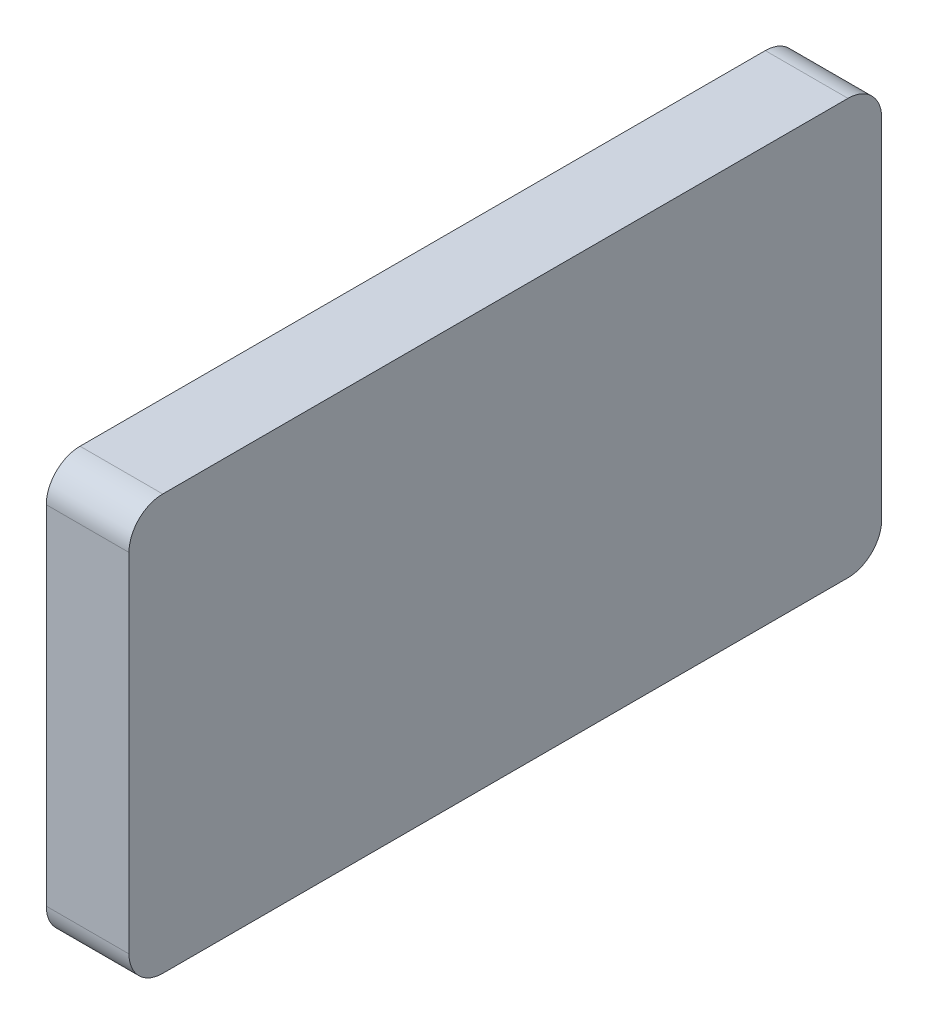
ISO-10303-21;
HEADER;
FILE_DESCRIPTION(('STEP AP214'),'2;1');
FILE_NAME('part.step','',(''),(''),'','','');
FILE_SCHEMA(('AUTOMOTIVE_DESIGN { 1 0 10303 214 1 1 1 1 }'));
ENDSEC;
DATA;
#1=APPLICATION_CONTEXT('core data for automotive mechanical design processes');
#2=APPLICATION_PROTOCOL_DEFINITION('international standard','automotive_design',2000,#1);
#3=PRODUCT_CONTEXT('',#1,'mechanical');
#4=PRODUCT('Part','Part','',(#3));
#5=PRODUCT_RELATED_PRODUCT_CATEGORY('part','',(#4));
#6=PRODUCT_DEFINITION_FORMATION('','',#4);
#7=PRODUCT_DEFINITION_CONTEXT('part definition',#1,'design');
#8=PRODUCT_DEFINITION('design','',#6,#7);
#9=PRODUCT_DEFINITION_SHAPE('','',#8);
#10=(LENGTH_UNIT() NAMED_UNIT(*) SI_UNIT(.MILLI.,.METRE.));
#11=(NAMED_UNIT(*) PLANE_ANGLE_UNIT() SI_UNIT($,.RADIAN.));
#12=(NAMED_UNIT(*) SI_UNIT($,.STERADIAN.) SOLID_ANGLE_UNIT());
#13=UNCERTAINTY_MEASURE_WITH_UNIT(LENGTH_MEASURE(1.E-05),#10,'distance_accuracy_value','');
#14=(GEOMETRIC_REPRESENTATION_CONTEXT(3) GLOBAL_UNCERTAINTY_ASSIGNED_CONTEXT((#13)) GLOBAL_UNIT_ASSIGNED_CONTEXT((#10,
#11,#12)) REPRESENTATION_CONTEXT('',''));
#15=CARTESIAN_POINT('',(0.,0.,0.));
#16=DIRECTION('',(0.,0.,1.));
#17=DIRECTION('',(1.,0.,0.));
#18=AXIS2_PLACEMENT_3D('',#15,#16,#17);
#19=CARTESIAN_POINT('',(0.45,-1.03,-2.03));
#20=DIRECTION('',(1.,0.,0.));
#21=DIRECTION('',(0.,0.,-1.));
#22=AXIS2_PLACEMENT_3D('',#19,#20,#21);
#23=PLANE('',#22);
#24=DIRECTION('',(0.,0.,-1.));
#25=VECTOR('',#24,1.);
#26=CARTESIAN_POINT('',(0.45,-1.23,2.03));
#27=LINE('',#26,#25);
#28=CARTESIAN_POINT('',(0.45,-1.23,2.03));
#29=VERTEX_POINT('',#28);
#30=CARTESIAN_POINT('',(0.45,-1.23,-2.03));
#31=VERTEX_POINT('',#30);
#32=EDGE_CURVE('E82',#29,#31,#27,.T.);
#33=ORIENTED_EDGE('',*,*,#32,.F.);
#34=CARTESIAN_POINT('',(0.45,-1.03,2.03));
#35=DIRECTION('',(-1.,0.,0.));
#36=DIRECTION('',(0.,0.,1.));
#37=AXIS2_PLACEMENT_3D('',#34,#35,#36);
#38=CIRCLE('',#37,0.2);
#39=CARTESIAN_POINT('',(0.45,-1.03,2.23));
#40=VERTEX_POINT('',#39);
#41=EDGE_CURVE('E98',#40,#29,#38,.F.);
#42=ORIENTED_EDGE('',*,*,#41,.F.);
#43=DIRECTION('',(0.,1.,0.));
#44=VECTOR('',#43,1.);
#45=CARTESIAN_POINT('',(0.45,1.03,2.23));
#46=LINE('',#45,#44);
#47=CARTESIAN_POINT('',(0.45,1.03,2.23));
#48=VERTEX_POINT('',#47);
#49=EDGE_CURVE('E104',#48,#40,#46,.F.);
#50=ORIENTED_EDGE('',*,*,#49,.F.);
#51=CARTESIAN_POINT('',(0.45,1.03,2.03));
#52=DIRECTION('',(-1.,0.,0.));
#53=DIRECTION('',(0.,0.,1.));
#54=AXIS2_PLACEMENT_3D('',#51,#52,#53);
#55=CIRCLE('',#54,0.2);
#56=CARTESIAN_POINT('',(0.45,1.23,2.03));
#57=VERTEX_POINT('',#56);
#58=EDGE_CURVE('E128',#57,#48,#55,.F.);
#59=ORIENTED_EDGE('',*,*,#58,.F.);
#60=DIRECTION('',(0.,0.,1.));
#61=VECTOR('',#60,1.);
#62=CARTESIAN_POINT('',(0.45,1.23,2.03));
#63=LINE('',#62,#61);
#64=CARTESIAN_POINT('',(0.45,1.23,-2.03));
#65=VERTEX_POINT('',#64);
#66=EDGE_CURVE('E109',#65,#57,#63,.T.);
#67=ORIENTED_EDGE('',*,*,#66,.F.);
#68=CARTESIAN_POINT('',(0.45,1.03,-2.03));
#69=DIRECTION('',(-1.,0.,0.));
#70=DIRECTION('',(0.,0.,1.));
#71=AXIS2_PLACEMENT_3D('',#68,#69,#70);
#72=CIRCLE('',#71,0.2);
#73=CARTESIAN_POINT('',(0.45,1.03,-2.23));
#74=VERTEX_POINT('',#73);
#75=EDGE_CURVE('E130',#74,#65,#72,.F.);
#76=ORIENTED_EDGE('',*,*,#75,.F.);
#77=DIRECTION('',(0.,1.,0.));
#78=VECTOR('',#77,1.);
#79=CARTESIAN_POINT('',(0.45,1.03,-2.23));
#80=LINE('',#79,#78);
#81=CARTESIAN_POINT('',(0.45,-1.03,-2.23));
#82=VERTEX_POINT('',#81);
#83=EDGE_CURVE('E84',#82,#74,#80,.T.);
#84=ORIENTED_EDGE('',*,*,#83,.F.);
#85=CARTESIAN_POINT('',(0.45,-1.03,-2.03));
#86=DIRECTION('',(-1.,0.,0.));
#87=DIRECTION('',(0.,0.,1.));
#88=AXIS2_PLACEMENT_3D('',#85,#86,#87);
#89=CIRCLE('',#88,0.2);
#90=EDGE_CURVE('E20',#31,#82,#89,.F.);
#91=ORIENTED_EDGE('',*,*,#90,.F.);
#92=EDGE_LOOP('',(#33,#42,#50,#59,#67,#76,#84,#91));
#93=FACE_BOUND('',#92,.T.);
#94=ADVANCED_FACE('F17',(#93),#23,.F.);
#95=CARTESIAN_POINT('',(0.94,-1.03,-2.03));
#96=DIRECTION('',(-1.,0.,0.));
#97=DIRECTION('',(0.,0.,1.));
#98=AXIS2_PLACEMENT_3D('',#95,#96,#97);
#99=CYLINDRICAL_SURFACE('',#98,0.2);
#100=CARTESIAN_POINT('',(0.94,-1.03,-2.03));
#101=DIRECTION('',(-1.,0.,0.));
#102=DIRECTION('',(0.,0.,1.));
#103=AXIS2_PLACEMENT_3D('',#100,#101,#102);
#104=CIRCLE('',#103,0.2);
#105=CARTESIAN_POINT('',(0.94,-1.23,-2.03));
#106=VERTEX_POINT('',#105);
#107=CARTESIAN_POINT('',(0.94,-1.03,-2.23));
#108=VERTEX_POINT('',#107);
#109=EDGE_CURVE('E91',#106,#108,#104,.F.);
#110=ORIENTED_EDGE('',*,*,#109,.F.);
#111=DIRECTION('',(1.,0.,0.));
#112=VECTOR('',#111,1.);
#113=CARTESIAN_POINT('',(0.94,-1.23,-2.03));
#114=LINE('',#113,#112);
#115=EDGE_CURVE('E88',#31,#106,#114,.T.);
#116=ORIENTED_EDGE('',*,*,#115,.F.);
#117=ORIENTED_EDGE('',*,*,#90,.T.);
#118=DIRECTION('',(-1.,0.,0.));
#119=VECTOR('',#118,1.);
#120=CARTESIAN_POINT('',(0.94,-1.03,-2.23));
#121=LINE('',#120,#119);
#122=EDGE_CURVE('E102',#108,#82,#121,.T.);
#123=ORIENTED_EDGE('',*,*,#122,.F.);
#124=EDGE_LOOP('',(#110,#116,#117,#123));
#125=FACE_BOUND('',#124,.T.);
#126=ADVANCED_FACE('F89',(#125),#99,.T.);
#127=CARTESIAN_POINT('',(0.94,1.03,-2.23));
#128=DIRECTION('',(0.,0.,-1.));
#129=DIRECTION('',(-1.,0.,0.));
#130=AXIS2_PLACEMENT_3D('',#127,#128,#129);
#131=PLANE('',#130);
#132=DIRECTION('',(0.,1.,0.));
#133=VECTOR('',#132,1.);
#134=CARTESIAN_POINT('',(0.94,-1.03,-2.23));
#135=LINE('',#134,#133);
#136=CARTESIAN_POINT('',(0.94,1.03,-2.23));
#137=VERTEX_POINT('',#136);
#138=EDGE_CURVE('E125',#108,#137,#135,.T.);
#139=ORIENTED_EDGE('',*,*,#138,.F.);
#140=ORIENTED_EDGE('',*,*,#122,.T.);
#141=ORIENTED_EDGE('',*,*,#83,.T.);
#142=DIRECTION('',(-1.,0.,0.));
#143=VECTOR('',#142,1.);
#144=CARTESIAN_POINT('',(0.94,1.03,-2.23));
#145=LINE('',#144,#143);
#146=EDGE_CURVE('E113',#137,#74,#145,.T.);
#147=ORIENTED_EDGE('',*,*,#146,.F.);
#148=EDGE_LOOP('',(#139,#140,#141,#147));
#149=FACE_BOUND('',#148,.T.);
#150=ADVANCED_FACE('F137',(#149),#131,.T.);
#151=CARTESIAN_POINT('',(0.94,1.03,-2.03));
#152=DIRECTION('',(-1.,0.,0.));
#153=DIRECTION('',(0.,0.,1.));
#154=AXIS2_PLACEMENT_3D('',#151,#152,#153);
#155=CYLINDRICAL_SURFACE('',#154,0.2);
#156=CARTESIAN_POINT('',(0.94,1.03,-2.03));
#157=DIRECTION('',(-1.,0.,0.));
#158=DIRECTION('',(0.,0.,1.));
#159=AXIS2_PLACEMENT_3D('',#156,#157,#158);
#160=CIRCLE('',#159,0.2);
#161=CARTESIAN_POINT('',(0.94,1.23,-2.03));
#162=VERTEX_POINT('',#161);
#163=EDGE_CURVE('E122',#137,#162,#160,.F.);
#164=ORIENTED_EDGE('',*,*,#163,.F.);
#165=ORIENTED_EDGE('',*,*,#146,.T.);
#166=ORIENTED_EDGE('',*,*,#75,.T.);
#167=DIRECTION('',(1.,0.,0.));
#168=VECTOR('',#167,1.);
#169=CARTESIAN_POINT('',(0.94,1.23,-2.03));
#170=LINE('',#169,#168);
#171=EDGE_CURVE('E112',#162,#65,#170,.F.);
#172=ORIENTED_EDGE('',*,*,#171,.F.);
#173=EDGE_LOOP('',(#164,#165,#166,#172));
#174=FACE_BOUND('',#173,.T.);
#175=ADVANCED_FACE('F160',(#174),#155,.T.);
#176=CARTESIAN_POINT('',(0.94,1.23,2.03));
#177=DIRECTION('',(0.,1.,0.));
#178=DIRECTION('',(0.,0.,1.));
#179=AXIS2_PLACEMENT_3D('',#176,#177,#178);
#180=PLANE('',#179);
#181=DIRECTION('',(0.,0.,-1.));
#182=VECTOR('',#181,1.);
#183=CARTESIAN_POINT('',(0.94,1.23,-2.03));
#184=LINE('',#183,#182);
#185=CARTESIAN_POINT('',(0.94,1.23,2.03));
#186=VERTEX_POINT('',#185);
#187=EDGE_CURVE('E121',#162,#186,#184,.F.);
#188=ORIENTED_EDGE('',*,*,#187,.F.);
#189=ORIENTED_EDGE('',*,*,#171,.T.);
#190=ORIENTED_EDGE('',*,*,#66,.T.);
#191=DIRECTION('',(-1.,0.,0.));
#192=VECTOR('',#191,1.);
#193=CARTESIAN_POINT('',(0.94,1.23,2.03));
#194=LINE('',#193,#192);
#195=EDGE_CURVE('E108',#186,#57,#194,.T.);
#196=ORIENTED_EDGE('',*,*,#195,.F.);
#197=EDGE_LOOP('',(#188,#189,#190,#196));
#198=FACE_BOUND('',#197,.T.);
#199=ADVANCED_FACE('F159',(#198),#180,.T.);
#200=CARTESIAN_POINT('',(0.94,1.03,2.03));
#201=DIRECTION('',(-1.,0.,0.));
#202=DIRECTION('',(0.,0.,1.));
#203=AXIS2_PLACEMENT_3D('',#200,#201,#202);
#204=CYLINDRICAL_SURFACE('',#203,0.2);
#205=CARTESIAN_POINT('',(0.94,1.03,2.03));
#206=DIRECTION('',(-1.,0.,0.));
#207=DIRECTION('',(0.,0.,1.));
#208=AXIS2_PLACEMENT_3D('',#205,#206,#207);
#209=CIRCLE('',#208,0.2);
#210=CARTESIAN_POINT('',(0.94,1.03,2.23));
#211=VERTEX_POINT('',#210);
#212=EDGE_CURVE('E118',#186,#211,#209,.F.);
#213=ORIENTED_EDGE('',*,*,#212,.F.);
#214=ORIENTED_EDGE('',*,*,#195,.T.);
#215=ORIENTED_EDGE('',*,*,#58,.T.);
#216=DIRECTION('',(1.,0.,0.));
#217=VECTOR('',#216,1.);
#218=CARTESIAN_POINT('',(0.94,1.03,2.23));
#219=LINE('',#218,#217);
#220=EDGE_CURVE('E107',#211,#48,#219,.F.);
#221=ORIENTED_EDGE('',*,*,#220,.F.);
#222=EDGE_LOOP('',(#213,#214,#215,#221));
#223=FACE_BOUND('',#222,.T.);
#224=ADVANCED_FACE('F152',(#223),#204,.T.);
#225=CARTESIAN_POINT('',(0.94,1.03,2.23));
#226=DIRECTION('',(0.,0.,1.));
#227=DIRECTION('',(1.,0.,0.));
#228=AXIS2_PLACEMENT_3D('',#225,#226,#227);
#229=PLANE('',#228);
#230=DIRECTION('',(0.,1.,0.));
#231=VECTOR('',#230,1.);
#232=CARTESIAN_POINT('',(0.94,-1.03,2.23));
#233=LINE('',#232,#231);
#234=CARTESIAN_POINT('',(0.94,-1.03,2.23));
#235=VERTEX_POINT('',#234);
#236=EDGE_CURVE('E117',#211,#235,#233,.F.);
#237=ORIENTED_EDGE('',*,*,#236,.F.);
#238=ORIENTED_EDGE('',*,*,#220,.T.);
#239=ORIENTED_EDGE('',*,*,#49,.T.);
#240=DIRECTION('',(-1.,0.,0.));
#241=VECTOR('',#240,1.);
#242=CARTESIAN_POINT('',(0.94,-1.03,2.23));
#243=LINE('',#242,#241);
#244=EDGE_CURVE('E95',#235,#40,#243,.T.);
#245=ORIENTED_EDGE('',*,*,#244,.F.);
#246=EDGE_LOOP('',(#237,#238,#239,#245));
#247=FACE_BOUND('',#246,.T.);
#248=ADVANCED_FACE('F147',(#247),#229,.T.);
#249=CARTESIAN_POINT('',(0.94,-1.03,2.03));
#250=DIRECTION('',(-1.,0.,0.));
#251=DIRECTION('',(0.,0.,1.));
#252=AXIS2_PLACEMENT_3D('',#249,#250,#251);
#253=CYLINDRICAL_SURFACE('',#252,0.2);
#254=CARTESIAN_POINT('',(0.94,-1.03,2.03));
#255=DIRECTION('',(-1.,0.,0.));
#256=DIRECTION('',(0.,0.,1.));
#257=AXIS2_PLACEMENT_3D('',#254,#255,#256);
#258=CIRCLE('',#257,0.2);
#259=CARTESIAN_POINT('',(0.94,-1.23,2.03));
#260=VERTEX_POINT('',#259);
#261=EDGE_CURVE('E26',#235,#260,#258,.F.);
#262=ORIENTED_EDGE('',*,*,#261,.F.);
#263=ORIENTED_EDGE('',*,*,#244,.T.);
#264=ORIENTED_EDGE('',*,*,#41,.T.);
#265=DIRECTION('',(1.,0.,0.));
#266=VECTOR('',#265,1.);
#267=CARTESIAN_POINT('',(0.94,-1.23,2.03));
#268=LINE('',#267,#266);
#269=EDGE_CURVE('E35',#260,#29,#268,.F.);
#270=ORIENTED_EDGE('',*,*,#269,.F.);
#271=EDGE_LOOP('',(#262,#263,#264,#270));
#272=FACE_BOUND('',#271,.T.);
#273=ADVANCED_FACE('F145',(#272),#253,.T.);
#274=CARTESIAN_POINT('',(0.94,-1.23,2.03));
#275=DIRECTION('',(0.,-1.,0.));
#276=DIRECTION('',(0.,0.,-1.));
#277=AXIS2_PLACEMENT_3D('',#274,#275,#276);
#278=PLANE('',#277);
#279=DIRECTION('',(0.,0.,-1.));
#280=VECTOR('',#279,1.);
#281=CARTESIAN_POINT('',(0.94,-1.23,-2.03));
#282=LINE('',#281,#280);
#283=EDGE_CURVE('E11',#260,#106,#282,.T.);
#284=ORIENTED_EDGE('',*,*,#283,.F.);
#285=ORIENTED_EDGE('',*,*,#269,.T.);
#286=ORIENTED_EDGE('',*,*,#32,.T.);
#287=ORIENTED_EDGE('',*,*,#115,.T.);
#288=EDGE_LOOP('',(#284,#285,#286,#287));
#289=FACE_BOUND('',#288,.T.);
#290=ADVANCED_FACE('F94',(#289),#278,.T.);
#291=CARTESIAN_POINT('',(0.94,-1.03,-2.03));
#292=DIRECTION('',(1.,0.,0.));
#293=DIRECTION('',(0.,0.,-1.));
#294=AXIS2_PLACEMENT_3D('',#291,#292,#293);
#295=PLANE('',#294);
#296=ORIENTED_EDGE('',*,*,#261,.T.);
#297=ORIENTED_EDGE('',*,*,#283,.T.);
#298=ORIENTED_EDGE('',*,*,#109,.T.);
#299=ORIENTED_EDGE('',*,*,#138,.T.);
#300=ORIENTED_EDGE('',*,*,#163,.T.);
#301=ORIENTED_EDGE('',*,*,#187,.T.);
#302=ORIENTED_EDGE('',*,*,#212,.T.);
#303=ORIENTED_EDGE('',*,*,#236,.T.);
#304=EDGE_LOOP('',(#296,#297,#298,#299,#300,#301,#302,#303));
#305=FACE_BOUND('',#304,.T.);
#306=ADVANCED_FACE('F142',(#305),#295,.T.);
#307=CLOSED_SHELL('',(#94,#126,#150,#175,#199,#224,#248,#273,#290,#306));
#308=MANIFOLD_SOLID_BREP('B1',#307);
#309=ADVANCED_BREP_SHAPE_REPRESENTATION('',(#18,#308),#14);
#310=SHAPE_DEFINITION_REPRESENTATION(#9,#309);
ENDSEC;
END-ISO-10303-21;
